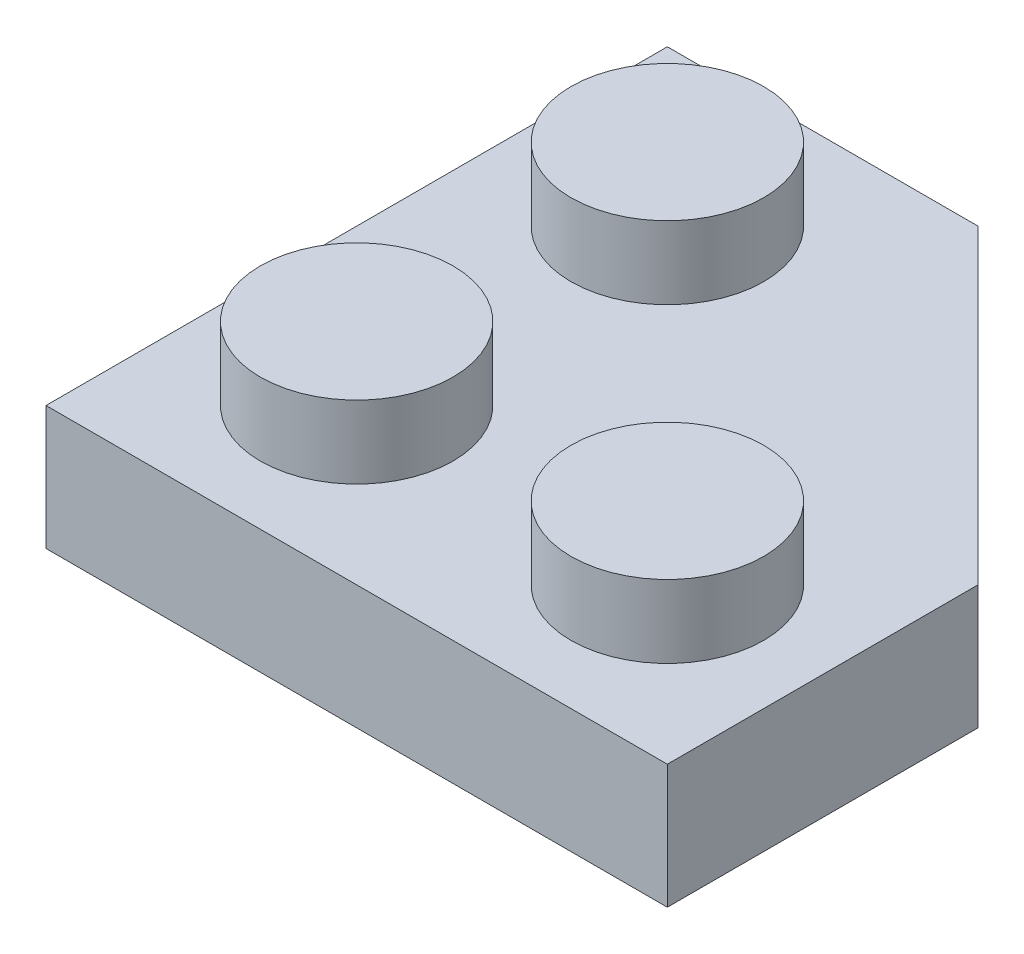
ISO-10303-21;
HEADER;
FILE_DESCRIPTION(('STEP AP214'),'2;1');
FILE_NAME('part.step','',(''),(''),'','','');
FILE_SCHEMA(('AUTOMOTIVE_DESIGN { 1 0 10303 214 1 1 1 1 }'));
ENDSEC;
DATA;
#1=APPLICATION_CONTEXT('core data for automotive mechanical design processes');
#2=APPLICATION_PROTOCOL_DEFINITION('international standard','automotive_design',2000,#1);
#3=PRODUCT_CONTEXT('',#1,'mechanical');
#4=PRODUCT('Part','Part','',(#3));
#5=PRODUCT_RELATED_PRODUCT_CATEGORY('part','',(#4));
#6=PRODUCT_DEFINITION_FORMATION('','',#4);
#7=PRODUCT_DEFINITION_CONTEXT('part definition',#1,'design');
#8=PRODUCT_DEFINITION('design','',#6,#7);
#9=PRODUCT_DEFINITION_SHAPE('','',#8);
#10=(LENGTH_UNIT() NAMED_UNIT(*) SI_UNIT(.MILLI.,.METRE.));
#11=(NAMED_UNIT(*) PLANE_ANGLE_UNIT() SI_UNIT($,.RADIAN.));
#12=(NAMED_UNIT(*) SI_UNIT($,.STERADIAN.) SOLID_ANGLE_UNIT());
#13=UNCERTAINTY_MEASURE_WITH_UNIT(LENGTH_MEASURE(1.E-05),#10,'distance_accuracy_value','');
#14=(GEOMETRIC_REPRESENTATION_CONTEXT(3) GLOBAL_UNCERTAINTY_ASSIGNED_CONTEXT((#13)) GLOBAL_UNIT_ASSIGNED_CONTEXT((#10,
#11,#12)) REPRESENTATION_CONTEXT('',''));
#15=CARTESIAN_POINT('',(0.,0.,0.));
#16=DIRECTION('',(0.,0.,1.));
#17=DIRECTION('',(1.,0.,0.));
#18=AXIS2_PLACEMENT_3D('',#15,#16,#17);
#19=CARTESIAN_POINT('',(-1.06066017177983,-3.15,-6.83933982822018));
#20=DIRECTION('',(-0.707106781186548,0.,0.707106781186548));
#21=DIRECTION('',(0.707106781186548,0.,0.707106781186548));
#22=AXIS2_PLACEMENT_3D('',#19,#20,#21);
#23=PLANE('',#22);
#24=DIRECTION('',(0.,-1.,0.));
#25=VECTOR('',#24,1.);
#26=CARTESIAN_POINT('',(4.65710678118655,-1.5,-1.12157287525381));
#27=LINE('',#26,#25);
#28=CARTESIAN_POINT('',(4.65710678118655,-1.7,-1.12157287525381));
#29=VERTEX_POINT('',#28);
#30=CARTESIAN_POINT('',(4.65710678118655,-2.95,-1.12157287525381));
#31=VERTEX_POINT('',#30);
#32=EDGE_CURVE('E334',#29,#31,#27,.T.);
#33=ORIENTED_EDGE('',*,*,#32,.T.);
#34=CARTESIAN_POINT('',(4.79852813742386,-2.95,-0.980151519016501));
#35=DIRECTION('',(-0.707106781186548,0.,0.707106781186548));
#36=DIRECTION('',(0.707106781186548,0.,0.707106781186548));
#37=AXIS2_PLACEMENT_3D('',#34,#35,#36);
#38=CIRCLE('',#37,0.2);
#39=CARTESIAN_POINT('',(4.79852813742385,-3.15,-0.9801515190165));
#40=VERTEX_POINT('',#39);
#41=EDGE_CURVE('E314',#31,#40,#38,.T.);
#42=ORIENTED_EDGE('',*,*,#41,.T.);
#43=DIRECTION('',(0.707106781186548,0.,0.707106781186548));
#44=VECTOR('',#43,1.);
#45=CARTESIAN_POINT('',(2.88933982822018,-3.15,-2.88933982822018));
#46=LINE('',#45,#44);
#47=CARTESIAN_POINT('',(6.4,-3.15,0.621320343559642));
#48=VERTEX_POINT('',#47);
#49=EDGE_CURVE('E231',#40,#48,#46,.T.);
#50=ORIENTED_EDGE('',*,*,#49,.T.);
#51=DIRECTION('',(0.,1.,0.));
#52=VECTOR('',#51,1.);
#53=CARTESIAN_POINT('',(6.4,-3.15,0.621320343559641));
#54=LINE('',#53,#52);
#55=CARTESIAN_POINT('',(6.4,-1.5,0.621320343559642));
#56=VERTEX_POINT('',#55);
#57=EDGE_CURVE('E200',#48,#56,#54,.T.);
#58=ORIENTED_EDGE('',*,*,#57,.T.);
#59=DIRECTION('',(0.707106781186548,0.,0.707106781186548));
#60=VECTOR('',#59,1.);
#61=CARTESIAN_POINT('',(2.88933982822018,-1.5,-2.88933982822018));
#62=LINE('',#61,#60);
#63=CARTESIAN_POINT('',(4.51568542494924,-1.5,-1.26299423149112));
#64=VERTEX_POINT('',#63);
#65=EDGE_CURVE('E170',#64,#56,#62,.T.);
#66=ORIENTED_EDGE('',*,*,#65,.F.);
#67=CARTESIAN_POINT('',(4.51568542494924,-1.7,-1.26299423149112));
#68=DIRECTION('',(-0.707106781186548,0.,0.707106781186548));
#69=DIRECTION('',(0.707106781186548,0.,0.707106781186548));
#70=AXIS2_PLACEMENT_3D('',#67,#68,#69);
#71=CIRCLE('',#70,0.2);
#72=EDGE_CURVE('E43',#64,#29,#71,.F.);
#73=ORIENTED_EDGE('',*,*,#72,.T.);
#74=EDGE_LOOP('',(#33,#42,#50,#58,#66,#73));
#75=FACE_BOUND('',#74,.T.);
#76=ADVANCED_FACE('F35',(#75),#23,.T.);
#77=CARTESIAN_POINT('',(7.9,-3.15,-7.9));
#78=DIRECTION('',(1.,0.,0.));
#79=DIRECTION('',(0.,0.,-1.));
#80=AXIS2_PLACEMENT_3D('',#77,#78,#79);
#81=PLANE('',#80);
#82=DIRECTION('',(0.,1.,0.));
#83=VECTOR('',#82,1.);
#84=CARTESIAN_POINT('',(7.9,-3.15,0.));
#85=LINE('',#84,#83);
#86=CARTESIAN_POINT('',(7.9,-3.15,0.));
#87=VERTEX_POINT('',#86);
#88=CARTESIAN_POINT('',(7.9,0.,0.));
#89=VERTEX_POINT('',#88);
#90=EDGE_CURVE('E236',#87,#89,#85,.T.);
#91=ORIENTED_EDGE('',*,*,#90,.T.);
#92=DIRECTION('',(0.,0.,-1.));
#93=VECTOR('',#92,1.);
#94=CARTESIAN_POINT('',(7.9,0.,-7.9));
#95=LINE('',#94,#93);
#96=CARTESIAN_POINT('',(7.9,0.,7.9));
#97=VERTEX_POINT('',#96);
#98=EDGE_CURVE('E256',#97,#89,#95,.T.);
#99=ORIENTED_EDGE('',*,*,#98,.F.);
#100=DIRECTION('',(0.,1.,0.));
#101=VECTOR('',#100,1.);
#102=CARTESIAN_POINT('',(7.9,-3.15,7.9));
#103=LINE('',#102,#101);
#104=CARTESIAN_POINT('',(7.9,-3.15,7.9));
#105=VERTEX_POINT('',#104);
#106=EDGE_CURVE('E281',#105,#97,#103,.T.);
#107=ORIENTED_EDGE('',*,*,#106,.F.);
#108=DIRECTION('',(0.,0.,-1.));
#109=VECTOR('',#108,1.);
#110=CARTESIAN_POINT('',(7.9,-3.15,-7.9));
#111=LINE('',#110,#109);
#112=EDGE_CURVE('E259',#105,#87,#111,.T.);
#113=ORIENTED_EDGE('',*,*,#112,.T.);
#114=EDGE_LOOP('',(#91,#99,#107,#113));
#115=FACE_BOUND('',#114,.T.);
#116=ADVANCED_FACE('F398',(#115),#81,.T.);
#117=CARTESIAN_POINT('',(-7.9,-3.15,7.9));
#118=DIRECTION('',(0.,0.,1.));
#119=DIRECTION('',(1.,0.,0.));
#120=AXIS2_PLACEMENT_3D('',#117,#118,#119);
#121=PLANE('',#120);
#122=DIRECTION('',(1.,0.,0.));
#123=VECTOR('',#122,1.);
#124=CARTESIAN_POINT('',(-7.9,0.,7.9));
#125=LINE('',#124,#123);
#126=CARTESIAN_POINT('',(-7.9,0.,7.9));
#127=VERTEX_POINT('',#126);
#128=EDGE_CURVE('E263',#127,#97,#125,.T.);
#129=ORIENTED_EDGE('',*,*,#128,.F.);
#130=DIRECTION('',(0.,1.,0.));
#131=VECTOR('',#130,1.);
#132=CARTESIAN_POINT('',(-7.9,-3.15,7.9));
#133=LINE('',#132,#131);
#134=CARTESIAN_POINT('',(-7.9,-3.15,7.9));
#135=VERTEX_POINT('',#134);
#136=EDGE_CURVE('E284',#135,#127,#133,.T.);
#137=ORIENTED_EDGE('',*,*,#136,.F.);
#138=DIRECTION('',(1.,0.,0.));
#139=VECTOR('',#138,1.);
#140=CARTESIAN_POINT('',(-7.9,-3.15,7.9));
#141=LINE('',#140,#139);
#142=EDGE_CURVE('E268',#135,#105,#141,.T.);
#143=ORIENTED_EDGE('',*,*,#142,.T.);
#144=ORIENTED_EDGE('',*,*,#106,.T.);
#145=EDGE_LOOP('',(#129,#137,#143,#144));
#146=FACE_BOUND('',#145,.T.);
#147=ADVANCED_FACE('F394',(#146),#121,.T.);
#148=CARTESIAN_POINT('',(-7.90000000000001,-3.15,-7.9));
#149=DIRECTION('',(-1.,0.,0.));
#150=DIRECTION('',(0.,0.,1.));
#151=AXIS2_PLACEMENT_3D('',#148,#149,#150);
#152=PLANE('',#151);
#153=DIRECTION('',(0.,0.,1.));
#154=VECTOR('',#153,1.);
#155=CARTESIAN_POINT('',(-7.90000000000001,0.,-7.9));
#156=LINE('',#155,#154);
#157=CARTESIAN_POINT('',(-7.90000000000001,0.,-7.9));
#158=VERTEX_POINT('',#157);
#159=EDGE_CURVE('E276',#158,#127,#156,.T.);
#160=ORIENTED_EDGE('',*,*,#159,.F.);
#161=DIRECTION('',(0.,1.,0.));
#162=VECTOR('',#161,1.);
#163=CARTESIAN_POINT('',(-7.90000000000001,-3.15,-7.9));
#164=LINE('',#163,#162);
#165=CARTESIAN_POINT('',(-7.90000000000001,-3.15,-7.9));
#166=VERTEX_POINT('',#165);
#167=EDGE_CURVE('E271',#166,#158,#164,.T.);
#168=ORIENTED_EDGE('',*,*,#167,.F.);
#169=DIRECTION('',(0.,0.,1.));
#170=VECTOR('',#169,1.);
#171=CARTESIAN_POINT('',(-7.90000000000001,-3.15,-7.9));
#172=LINE('',#171,#170);
#173=EDGE_CURVE('E265',#166,#135,#172,.T.);
#174=ORIENTED_EDGE('',*,*,#173,.T.);
#175=ORIENTED_EDGE('',*,*,#136,.T.);
#176=EDGE_LOOP('',(#160,#168,#174,#175));
#177=FACE_BOUND('',#176,.T.);
#178=ADVANCED_FACE('F387',(#177),#152,.T.);
#179=CARTESIAN_POINT('',(-7.90000000000001,-3.15,-7.9));
#180=DIRECTION('',(0.,0.,-1.));
#181=DIRECTION('',(-1.,0.,0.));
#182=AXIS2_PLACEMENT_3D('',#179,#180,#181);
#183=PLANE('',#182);
#184=DIRECTION('',(0.,1.,0.));
#185=VECTOR('',#184,1.);
#186=CARTESIAN_POINT('',(0.,-3.15,-7.9));
#187=LINE('',#186,#185);
#188=CARTESIAN_POINT('',(0.,-3.15,-7.9));
#189=VERTEX_POINT('',#188);
#190=CARTESIAN_POINT('',(0.,0.,-7.9));
#191=VERTEX_POINT('',#190);
#192=EDGE_CURVE('E235',#189,#191,#187,.T.);
#193=ORIENTED_EDGE('',*,*,#192,.F.);
#194=DIRECTION('',(-1.,0.,0.));
#195=VECTOR('',#194,1.);
#196=CARTESIAN_POINT('',(-7.90000000000001,-3.15,-7.9));
#197=LINE('',#196,#195);
#198=EDGE_CURVE('E262',#189,#166,#197,.T.);
#199=ORIENTED_EDGE('',*,*,#198,.T.);
#200=ORIENTED_EDGE('',*,*,#167,.T.);
#201=DIRECTION('',(-1.,0.,0.));
#202=VECTOR('',#201,1.);
#203=CARTESIAN_POINT('',(-7.90000000000001,0.,-7.9));
#204=LINE('',#203,#202);
#205=EDGE_CURVE('E274',#191,#158,#204,.T.);
#206=ORIENTED_EDGE('',*,*,#205,.F.);
#207=EDGE_LOOP('',(#193,#199,#200,#206));
#208=FACE_BOUND('',#207,.T.);
#209=ADVANCED_FACE('F383',(#208),#183,.T.);
#210=CARTESIAN_POINT('',(0.,-3.15,0.));
#211=DIRECTION('',(0.,1.,0.));
#212=DIRECTION('',(0.,0.,1.));
#213=AXIS2_PLACEMENT_3D('',#210,#211,#212);
#214=PLANE('',#213);
#215=DIRECTION('',(0.707106781186548,0.,0.707106781186547));
#216=VECTOR('',#215,1.);
#217=CARTESIAN_POINT('',(0.,-3.15,-7.9));
#218=LINE('',#217,#216);
#219=CARTESIAN_POINT('',(2.04081169079632,-3.15,-5.85918830920368));
#220=VERTEX_POINT('',#219);
#221=EDGE_CURVE('E232',#189,#220,#218,.T.);
#222=ORIENTED_EDGE('',*,*,#221,.T.);
#223=DIRECTION('',(0.707106781186548,0.,-0.707106781186547));
#224=VECTOR('',#223,1.);
#225=CARTESIAN_POINT('',(-1.90918830920368,-3.15,-1.90918830920368));
#226=LINE('',#225,#224);
#227=CARTESIAN_POINT('',(0.980151519016497,-3.15,-4.79852813742386));
#228=VERTEX_POINT('',#227);
#229=EDGE_CURVE('E301',#220,#228,#226,.F.);
#230=ORIENTED_EDGE('',*,*,#229,.T.);
#231=CARTESIAN_POINT('',(-0.621320343559648,-3.15,-6.4));
#232=VERTEX_POINT('',#231);
#233=EDGE_CURVE('E201',#232,#228,#46,.T.);
#234=ORIENTED_EDGE('',*,*,#233,.F.);
#235=DIRECTION('',(-1.,0.,0.));
#236=VECTOR('',#235,1.);
#237=CARTESIAN_POINT('',(0.,-3.15,-6.4));
#238=LINE('',#237,#236);
#239=CARTESIAN_POINT('',(-6.40000000000001,-3.15,-6.4));
#240=VERTEX_POINT('',#239);
#241=EDGE_CURVE('E189',#232,#240,#238,.T.);
#242=ORIENTED_EDGE('',*,*,#241,.T.);
#243=DIRECTION('',(0.,0.,1.));
#244=VECTOR('',#243,1.);
#245=CARTESIAN_POINT('',(-6.40000000000001,-3.15,0.));
#246=LINE('',#245,#244);
#247=CARTESIAN_POINT('',(-6.4,-3.15,6.4));
#248=VERTEX_POINT('',#247);
#249=EDGE_CURVE('E224',#240,#248,#246,.T.);
#250=ORIENTED_EDGE('',*,*,#249,.T.);
#251=DIRECTION('',(1.,0.,0.));
#252=VECTOR('',#251,1.);
#253=CARTESIAN_POINT('',(0.,-3.15,6.4));
#254=LINE('',#253,#252);
#255=CARTESIAN_POINT('',(6.4,-3.15,6.4));
#256=VERTEX_POINT('',#255);
#257=EDGE_CURVE('E197',#248,#256,#254,.T.);
#258=ORIENTED_EDGE('',*,*,#257,.T.);
#259=DIRECTION('',(0.,0.,-1.));
#260=VECTOR('',#259,1.);
#261=CARTESIAN_POINT('',(6.4,-3.15,0.));
#262=LINE('',#261,#260);
#263=EDGE_CURVE('E166',#256,#48,#262,.T.);
#264=ORIENTED_EDGE('',*,*,#263,.T.);
#265=ORIENTED_EDGE('',*,*,#49,.F.);
#266=DIRECTION('',(0.707106781186548,0.,-0.707106781186547));
#267=VECTOR('',#266,1.);
#268=CARTESIAN_POINT('',(1.90918830920368,-3.15,1.90918830920368));
#269=LINE('',#268,#267);
#270=CARTESIAN_POINT('',(5.85918830920368,-3.15,-2.04081169079632));
#271=VERTEX_POINT('',#270);
#272=EDGE_CURVE('E298',#40,#271,#269,.T.);
#273=ORIENTED_EDGE('',*,*,#272,.T.);
#274=EDGE_CURVE('E205',#271,#87,#218,.T.);
#275=ORIENTED_EDGE('',*,*,#274,.T.);
#276=ORIENTED_EDGE('',*,*,#112,.F.);
#277=ORIENTED_EDGE('',*,*,#142,.F.);
#278=ORIENTED_EDGE('',*,*,#173,.F.);
#279=ORIENTED_EDGE('',*,*,#198,.F.);
#280=EDGE_LOOP('',(#222,#230,#234,#242,#250,#258,#264,#265,#273,#275,#276,#277,#278,#279));
#281=FACE_BOUND('',#280,.T.);
#282=ADVANCED_FACE('F352',(#281),#214,.F.);
#283=CARTESIAN_POINT('',(0.,0.,0.));
#284=DIRECTION('',(0.,1.,0.));
#285=DIRECTION('',(0.,0.,1.));
#286=AXIS2_PLACEMENT_3D('',#283,#284,#285);
#287=PLANE('',#286);
#288=DIRECTION('',(0.707106781186548,0.,0.707106781186548));
#289=VECTOR('',#288,1.);
#290=CARTESIAN_POINT('',(3.95,0.,-3.95));
#291=LINE('',#290,#289);
#292=EDGE_CURVE('E283',#191,#89,#291,.T.);
#293=ORIENTED_EDGE('',*,*,#292,.F.);
#294=ORIENTED_EDGE('',*,*,#205,.T.);
#295=ORIENTED_EDGE('',*,*,#159,.T.);
#296=ORIENTED_EDGE('',*,*,#128,.T.);
#297=ORIENTED_EDGE('',*,*,#98,.T.);
#298=EDGE_LOOP('',(#293,#294,#295,#296,#297));
#299=FACE_BOUND('',#298,.T.);
#300=CARTESIAN_POINT('',(3.95,0.,3.95));
#301=DIRECTION('',(0.,1.,0.));
#302=DIRECTION('',(0.,0.,1.));
#303=AXIS2_PLACEMENT_3D('',#300,#301,#302);
#304=CIRCLE('',#303,2.45);
#305=CARTESIAN_POINT('',(3.95,0.,6.4));
#306=VERTEX_POINT('',#305);
#307=EDGE_CURVE('E239',#306,#306,#304,.T.);
#308=ORIENTED_EDGE('',*,*,#307,.F.);
#309=EDGE_LOOP('',(#308));
#310=FACE_BOUND('',#309,.T.);
#311=CARTESIAN_POINT('',(-3.95000000000001,0.,3.95));
#312=DIRECTION('',(0.,1.,0.));
#313=DIRECTION('',(0.,0.,1.));
#314=AXIS2_PLACEMENT_3D('',#311,#312,#313);
#315=CIRCLE('',#314,2.45);
#316=CARTESIAN_POINT('',(-3.95000000000001,0.,6.4));
#317=VERTEX_POINT('',#316);
#318=EDGE_CURVE('E244',#317,#317,#315,.T.);
#319=ORIENTED_EDGE('',*,*,#318,.F.);
#320=EDGE_LOOP('',(#319));
#321=FACE_BOUND('',#320,.T.);
#322=CARTESIAN_POINT('',(-3.95000000000001,0.,-3.95));
#323=DIRECTION('',(0.,1.,0.));
#324=DIRECTION('',(0.,0.,1.));
#325=AXIS2_PLACEMENT_3D('',#322,#323,#324);
#326=CIRCLE('',#325,2.45);
#327=CARTESIAN_POINT('',(-3.95000000000001,0.,-1.5));
#328=VERTEX_POINT('',#327);
#329=EDGE_CURVE('E250',#328,#328,#326,.T.);
#330=ORIENTED_EDGE('',*,*,#329,.F.);
#331=EDGE_LOOP('',(#330));
#332=FACE_BOUND('',#331,.T.);
#333=ADVANCED_FACE('F391',(#299,#310,#321,#332),#287,.T.);
#334=CARTESIAN_POINT('',(-3.95000000000001,1.85,-3.95));
#335=DIRECTION('',(0.,-1.,0.));
#336=DIRECTION('',(0.,0.,-1.));
#337=AXIS2_PLACEMENT_3D('',#334,#335,#336);
#338=CYLINDRICAL_SURFACE('',#337,2.45);
#339=CARTESIAN_POINT('',(-3.95000000000001,1.85,-3.95));
#340=DIRECTION('',(0.,1.,0.));
#341=DIRECTION('',(0.,0.,1.));
#342=AXIS2_PLACEMENT_3D('',#339,#340,#341);
#343=CIRCLE('',#342,2.45);
#344=CARTESIAN_POINT('',(-3.95000000000001,1.85,-1.5));
#345=VERTEX_POINT('',#344);
#346=EDGE_CURVE('E253',#345,#345,#343,.T.);
#347=ORIENTED_EDGE('',*,*,#346,.F.);
#348=EDGE_LOOP('',(#347));
#349=FACE_BOUND('',#348,.T.);
#350=ORIENTED_EDGE('',*,*,#329,.T.);
#351=EDGE_LOOP('',(#350));
#352=FACE_BOUND('',#351,.T.);
#353=ADVANCED_FACE('F643',(#349,#352),#338,.T.);
#354=CARTESIAN_POINT('',(-3.95000000000001,1.85,-3.95));
#355=DIRECTION('',(0.,1.,0.));
#356=DIRECTION('',(0.,0.,1.));
#357=AXIS2_PLACEMENT_3D('',#354,#355,#356);
#358=PLANE('',#357);
#359=ORIENTED_EDGE('',*,*,#346,.T.);
#360=EDGE_LOOP('',(#359));
#361=FACE_BOUND('',#360,.T.);
#362=ADVANCED_FACE('F698',(#361),#358,.T.);
#363=CARTESIAN_POINT('',(-3.95000000000001,1.85,3.95));
#364=DIRECTION('',(0.,-1.,0.));
#365=DIRECTION('',(0.,0.,-1.));
#366=AXIS2_PLACEMENT_3D('',#363,#364,#365);
#367=CYLINDRICAL_SURFACE('',#366,2.45);
#368=CARTESIAN_POINT('',(-3.95000000000001,1.85,3.95));
#369=DIRECTION('',(0.,1.,0.));
#370=DIRECTION('',(0.,0.,1.));
#371=AXIS2_PLACEMENT_3D('',#368,#369,#370);
#372=CIRCLE('',#371,2.45);
#373=CARTESIAN_POINT('',(-3.95000000000001,1.85,6.4));
#374=VERTEX_POINT('',#373);
#375=EDGE_CURVE('E247',#374,#374,#372,.T.);
#376=ORIENTED_EDGE('',*,*,#375,.F.);
#377=EDGE_LOOP('',(#376));
#378=FACE_BOUND('',#377,.T.);
#379=ORIENTED_EDGE('',*,*,#318,.T.);
#380=EDGE_LOOP('',(#379));
#381=FACE_BOUND('',#380,.T.);
#382=ADVANCED_FACE('F688',(#378,#381),#367,.T.);
#383=CARTESIAN_POINT('',(-3.95000000000001,1.85,3.95));
#384=DIRECTION('',(0.,1.,0.));
#385=DIRECTION('',(0.,0.,1.));
#386=AXIS2_PLACEMENT_3D('',#383,#384,#385);
#387=PLANE('',#386);
#388=ORIENTED_EDGE('',*,*,#375,.T.);
#389=EDGE_LOOP('',(#388));
#390=FACE_BOUND('',#389,.T.);
#391=ADVANCED_FACE('F678',(#390),#387,.T.);
#392=CARTESIAN_POINT('',(3.95,1.85,3.95));
#393=DIRECTION('',(0.,-1.,0.));
#394=DIRECTION('',(0.,0.,-1.));
#395=AXIS2_PLACEMENT_3D('',#392,#393,#394);
#396=CYLINDRICAL_SURFACE('',#395,2.45);
#397=CARTESIAN_POINT('',(3.95,1.85,3.95));
#398=DIRECTION('',(0.,1.,0.));
#399=DIRECTION('',(0.,0.,1.));
#400=AXIS2_PLACEMENT_3D('',#397,#398,#399);
#401=CIRCLE('',#400,2.45);
#402=CARTESIAN_POINT('',(3.95,1.85,6.4));
#403=VERTEX_POINT('',#402);
#404=EDGE_CURVE('E241',#403,#403,#401,.T.);
#405=ORIENTED_EDGE('',*,*,#404,.F.);
#406=EDGE_LOOP('',(#405));
#407=FACE_BOUND('',#406,.T.);
#408=ORIENTED_EDGE('',*,*,#307,.T.);
#409=EDGE_LOOP('',(#408));
#410=FACE_BOUND('',#409,.T.);
#411=ADVANCED_FACE('F668',(#407,#410),#396,.T.);
#412=CARTESIAN_POINT('',(3.95,1.85,3.95));
#413=DIRECTION('',(0.,1.,0.));
#414=DIRECTION('',(0.,0.,1.));
#415=AXIS2_PLACEMENT_3D('',#412,#413,#414);
#416=PLANE('',#415);
#417=ORIENTED_EDGE('',*,*,#404,.T.);
#418=EDGE_LOOP('',(#417));
#419=FACE_BOUND('',#418,.T.);
#420=ADVANCED_FACE('F563',(#419),#416,.T.);
#421=CARTESIAN_POINT('',(0.,-3.15,-7.9));
#422=DIRECTION('',(-0.707106781186548,0.,0.707106781186548));
#423=DIRECTION('',(0.707106781186548,0.,0.707106781186548));
#424=AXIS2_PLACEMENT_3D('',#421,#422,#423);
#425=PLANE('',#424);
#426=DIRECTION('',(0.,1.,0.));
#427=VECTOR('',#426,1.);
#428=CARTESIAN_POINT('',(2.18223304703363,-1.5,-5.71776695296637));
#429=LINE('',#428,#427);
#430=CARTESIAN_POINT('',(2.18223304703363,-2.95,-5.71776695296637));
#431=VERTEX_POINT('',#430);
#432=CARTESIAN_POINT('',(2.18223304703363,-1.7,-5.71776695296637));
#433=VERTEX_POINT('',#432);
#434=EDGE_CURVE('E335',#431,#433,#429,.T.);
#435=ORIENTED_EDGE('',*,*,#434,.F.);
#436=CARTESIAN_POINT('',(2.04081169079632,-2.95,-5.85918830920368));
#437=DIRECTION('',(-0.707106781186548,0.,0.707106781186548));
#438=DIRECTION('',(0.707106781186548,0.,0.707106781186548));
#439=AXIS2_PLACEMENT_3D('',#436,#437,#438);
#440=CIRCLE('',#439,0.2);
#441=EDGE_CURVE('E296',#431,#220,#440,.F.);
#442=ORIENTED_EDGE('',*,*,#441,.T.);
#443=ORIENTED_EDGE('',*,*,#221,.F.);
#444=ORIENTED_EDGE('',*,*,#192,.T.);
#445=ORIENTED_EDGE('',*,*,#292,.T.);
#446=ORIENTED_EDGE('',*,*,#90,.F.);
#447=ORIENTED_EDGE('',*,*,#274,.F.);
#448=CARTESIAN_POINT('',(5.85918830920368,-2.95,-2.04081169079632));
#449=DIRECTION('',(-0.707106781186548,0.,0.707106781186548));
#450=DIRECTION('',(0.707106781186548,0.,0.707106781186548));
#451=AXIS2_PLACEMENT_3D('',#448,#449,#450);
#452=CIRCLE('',#451,0.2);
#453=CARTESIAN_POINT('',(5.71776695296637,-2.95,-2.18223304703363));
#454=VERTEX_POINT('',#453);
#455=EDGE_CURVE('E294',#271,#454,#452,.F.);
#456=ORIENTED_EDGE('',*,*,#455,.T.);
#457=DIRECTION('',(0.,-1.,0.));
#458=VECTOR('',#457,1.);
#459=CARTESIAN_POINT('',(5.71776695296637,-1.5,-2.18223304703363));
#460=LINE('',#459,#458);
#461=CARTESIAN_POINT('',(5.71776695296637,-1.7,-2.18223304703363));
#462=VERTEX_POINT('',#461);
#463=EDGE_CURVE('E329',#462,#454,#460,.T.);
#464=ORIENTED_EDGE('',*,*,#463,.F.);
#465=CARTESIAN_POINT('',(5.57634559672906,-1.7,-2.32365440327094));
#466=DIRECTION('',(-0.707106781186548,0.,0.707106781186548));
#467=DIRECTION('',(0.707106781186548,0.,0.707106781186548));
#468=AXIS2_PLACEMENT_3D('',#465,#466,#467);
#469=CIRCLE('',#468,0.2);
#470=CARTESIAN_POINT('',(5.57634559672906,-1.5,-2.32365440327094));
#471=VERTEX_POINT('',#470);
#472=EDGE_CURVE('E321',#462,#471,#469,.T.);
#473=ORIENTED_EDGE('',*,*,#472,.T.);
#474=DIRECTION('',(0.707106781186547,0.,0.707106781186548));
#475=VECTOR('',#474,1.);
#476=CARTESIAN_POINT('',(5.71776695296637,-1.5,-2.18223304703363));
#477=LINE('',#476,#475);
#478=CARTESIAN_POINT('',(2.32365440327094,-1.5,-5.57634559672906));
#479=VERTEX_POINT('',#478);
#480=EDGE_CURVE('E328',#479,#471,#477,.T.);
#481=ORIENTED_EDGE('',*,*,#480,.F.);
#482=CARTESIAN_POINT('',(2.32365440327094,-1.7,-5.57634559672906));
#483=DIRECTION('',(-0.707106781186548,0.,0.707106781186548));
#484=DIRECTION('',(0.707106781186548,0.,0.707106781186548));
#485=AXIS2_PLACEMENT_3D('',#482,#483,#484);
#486=CIRCLE('',#485,0.2);
#487=EDGE_CURVE('E316',#479,#433,#486,.T.);
#488=ORIENTED_EDGE('',*,*,#487,.T.);
#489=EDGE_LOOP('',(#435,#442,#443,#444,#445,#446,#447,#456,#464,#473,#481,#488));
#490=FACE_BOUND('',#489,.T.);
#491=ADVANCED_FACE('F327',(#490),#425,.F.);
#492=CARTESIAN_POINT('',(6.4,-3.15,-7.9));
#493=DIRECTION('',(1.,0.,0.));
#494=DIRECTION('',(0.,0.,-1.));
#495=AXIS2_PLACEMENT_3D('',#492,#493,#494);
#496=PLANE('',#495);
#497=ORIENTED_EDGE('',*,*,#57,.F.);
#498=ORIENTED_EDGE('',*,*,#263,.F.);
#499=DIRECTION('',(0.,1.,0.));
#500=VECTOR('',#499,1.);
#501=CARTESIAN_POINT('',(6.4,-3.15,6.4));
#502=LINE('',#501,#500);
#503=CARTESIAN_POINT('',(6.4,-1.5,6.4));
#504=VERTEX_POINT('',#503);
#505=EDGE_CURVE('E160',#256,#504,#502,.T.);
#506=ORIENTED_EDGE('',*,*,#505,.T.);
#507=DIRECTION('',(0.,0.,-1.));
#508=VECTOR('',#507,1.);
#509=CARTESIAN_POINT('',(6.4,-1.5,0.));
#510=LINE('',#509,#508);
#511=EDGE_CURVE('E164',#504,#56,#510,.T.);
#512=ORIENTED_EDGE('',*,*,#511,.T.);
#513=EDGE_LOOP('',(#497,#498,#506,#512));
#514=FACE_BOUND('',#513,.T.);
#515=ADVANCED_FACE('F163',(#514),#496,.F.);
#516=CARTESIAN_POINT('',(-7.9,-3.15,6.4));
#517=DIRECTION('',(0.,0.,1.));
#518=DIRECTION('',(1.,0.,0.));
#519=AXIS2_PLACEMENT_3D('',#516,#517,#518);
#520=PLANE('',#519);
#521=DIRECTION('',(1.,0.,0.));
#522=VECTOR('',#521,1.);
#523=CARTESIAN_POINT('',(0.,-1.5,6.4));
#524=LINE('',#523,#522);
#525=CARTESIAN_POINT('',(-6.4,-1.5,6.4));
#526=VERTEX_POINT('',#525);
#527=EDGE_CURVE('E178',#526,#504,#524,.T.);
#528=ORIENTED_EDGE('',*,*,#527,.T.);
#529=ORIENTED_EDGE('',*,*,#505,.F.);
#530=ORIENTED_EDGE('',*,*,#257,.F.);
#531=DIRECTION('',(0.,1.,0.));
#532=VECTOR('',#531,1.);
#533=CARTESIAN_POINT('',(-6.4,-3.15,6.4));
#534=LINE('',#533,#532);
#535=EDGE_CURVE('E171',#248,#526,#534,.T.);
#536=ORIENTED_EDGE('',*,*,#535,.T.);
#537=EDGE_LOOP('',(#528,#529,#530,#536));
#538=FACE_BOUND('',#537,.T.);
#539=ADVANCED_FACE('F184',(#538),#520,.F.);
#540=CARTESIAN_POINT('',(-6.40000000000001,-3.15,-7.9));
#541=DIRECTION('',(-1.,0.,0.));
#542=DIRECTION('',(0.,0.,1.));
#543=AXIS2_PLACEMENT_3D('',#540,#541,#542);
#544=PLANE('',#543);
#545=DIRECTION('',(0.,0.,1.));
#546=VECTOR('',#545,1.);
#547=CARTESIAN_POINT('',(-6.40000000000001,-1.5,0.));
#548=LINE('',#547,#546);
#549=CARTESIAN_POINT('',(-6.40000000000001,-1.5,-6.4));
#550=VERTEX_POINT('',#549);
#551=EDGE_CURVE('E187',#550,#526,#548,.T.);
#552=ORIENTED_EDGE('',*,*,#551,.T.);
#553=ORIENTED_EDGE('',*,*,#535,.F.);
#554=ORIENTED_EDGE('',*,*,#249,.F.);
#555=DIRECTION('',(0.,1.,0.));
#556=VECTOR('',#555,1.);
#557=CARTESIAN_POINT('',(-6.40000000000001,-3.15,-6.4));
#558=LINE('',#557,#556);
#559=EDGE_CURVE('E193',#240,#550,#558,.T.);
#560=ORIENTED_EDGE('',*,*,#559,.T.);
#561=EDGE_LOOP('',(#552,#553,#554,#560));
#562=FACE_BOUND('',#561,.T.);
#563=ADVANCED_FACE('F356',(#562),#544,.F.);
#564=CARTESIAN_POINT('',(-7.90000000000001,-3.15,-6.4));
#565=DIRECTION('',(0.,0.,-1.));
#566=DIRECTION('',(-1.,0.,0.));
#567=AXIS2_PLACEMENT_3D('',#564,#565,#566);
#568=PLANE('',#567);
#569=DIRECTION('',(0.,1.,0.));
#570=VECTOR('',#569,1.);
#571=CARTESIAN_POINT('',(-0.621320343559648,-3.15,-6.4));
#572=LINE('',#571,#570);
#573=CARTESIAN_POINT('',(-0.621320343559648,-1.5,-6.4));
#574=VERTEX_POINT('',#573);
#575=EDGE_CURVE('E198',#232,#574,#572,.T.);
#576=ORIENTED_EDGE('',*,*,#575,.T.);
#577=DIRECTION('',(-1.,0.,0.));
#578=VECTOR('',#577,1.);
#579=CARTESIAN_POINT('',(0.,-1.5,-6.4));
#580=LINE('',#579,#578);
#581=EDGE_CURVE('E181',#574,#550,#580,.T.);
#582=ORIENTED_EDGE('',*,*,#581,.T.);
#583=ORIENTED_EDGE('',*,*,#559,.F.);
#584=ORIENTED_EDGE('',*,*,#241,.F.);
#585=EDGE_LOOP('',(#576,#582,#583,#584));
#586=FACE_BOUND('',#585,.T.);
#587=ADVANCED_FACE('F360',(#586),#568,.F.);
#588=CARTESIAN_POINT('',(0.,-1.5,0.));
#589=DIRECTION('',(0.,1.,0.));
#590=DIRECTION('',(0.,0.,1.));
#591=AXIS2_PLACEMENT_3D('',#588,#589,#590);
#592=PLANE('',#591);
#593=CARTESIAN_POINT('',(0.,-1.5,0.));
#594=DIRECTION('',(0.,1.,0.));
#595=DIRECTION('',(0.,0.,1.));
#596=AXIS2_PLACEMENT_3D('',#593,#594,#595);
#597=CIRCLE('',#596,3.25);
#598=CARTESIAN_POINT('',(0.,-1.5,3.25));
#599=VERTEX_POINT('',#598);
#600=EDGE_CURVE('E12',#599,#599,#597,.F.);
#601=ORIENTED_EDGE('',*,*,#600,.F.);
#602=EDGE_LOOP('',(#601));
#603=FACE_BOUND('',#602,.T.);
#604=CARTESIAN_POINT('',(1.26299423149112,-1.5,-4.51568542494924));
#605=VERTEX_POINT('',#604);
#606=EDGE_CURVE('E203',#574,#605,#62,.T.);
#607=ORIENTED_EDGE('',*,*,#606,.T.);
#608=DIRECTION('',(0.707106781186548,0.,-0.707106781186547));
#609=VECTOR('',#608,1.);
#610=CARTESIAN_POINT('',(2.32365440327094,-1.5,-5.57634559672906));
#611=LINE('',#610,#609);
#612=EDGE_CURVE('E307',#605,#479,#611,.T.);
#613=ORIENTED_EDGE('',*,*,#612,.T.);
#614=ORIENTED_EDGE('',*,*,#480,.T.);
#615=DIRECTION('',(0.707106781186548,0.,-0.707106781186547));
#616=VECTOR('',#615,1.);
#617=CARTESIAN_POINT('',(4.51568542494924,-1.5,-1.26299423149112));
#618=LINE('',#617,#616);
#619=EDGE_CURVE('E305',#471,#64,#618,.F.);
#620=ORIENTED_EDGE('',*,*,#619,.T.);
#621=ORIENTED_EDGE('',*,*,#65,.T.);
#622=ORIENTED_EDGE('',*,*,#511,.F.);
#623=ORIENTED_EDGE('',*,*,#527,.F.);
#624=ORIENTED_EDGE('',*,*,#551,.F.);
#625=ORIENTED_EDGE('',*,*,#581,.F.);
#626=EDGE_LOOP('',(#607,#613,#614,#620,#621,#622,#623,#624,#625));
#627=FACE_BOUND('',#626,.T.);
#628=CARTESIAN_POINT('',(3.95,-1.5,3.95));
#629=DIRECTION('',(0.,1.,0.));
#630=DIRECTION('',(0.,0.,1.));
#631=AXIS2_PLACEMENT_3D('',#628,#629,#630);
#632=CIRCLE('',#631,0.950000000000001);
#633=CARTESIAN_POINT('',(3.95,-1.5,4.9));
#634=VERTEX_POINT('',#633);
#635=EDGE_CURVE('E206',#634,#634,#632,.T.);
#636=ORIENTED_EDGE('',*,*,#635,.T.);
#637=EDGE_LOOP('',(#636));
#638=FACE_BOUND('',#637,.T.);
#639=CARTESIAN_POINT('',(-3.95000000000001,-1.5,3.95));
#640=DIRECTION('',(0.,1.,0.));
#641=DIRECTION('',(0.,0.,1.));
#642=AXIS2_PLACEMENT_3D('',#639,#640,#641);
#643=CIRCLE('',#642,0.950000000000001);
#644=CARTESIAN_POINT('',(-3.95000000000001,-1.5,4.9));
#645=VERTEX_POINT('',#644);
#646=EDGE_CURVE('E210',#645,#645,#643,.T.);
#647=ORIENTED_EDGE('',*,*,#646,.T.);
#648=EDGE_LOOP('',(#647));
#649=FACE_BOUND('',#648,.T.);
#650=CARTESIAN_POINT('',(-3.95000000000001,-1.5,-3.95));
#651=DIRECTION('',(0.,1.,0.));
#652=DIRECTION('',(0.,0.,1.));
#653=AXIS2_PLACEMENT_3D('',#650,#651,#652);
#654=CIRCLE('',#653,0.950000000000001);
#655=CARTESIAN_POINT('',(-3.95000000000001,-1.5,-3.));
#656=VERTEX_POINT('',#655);
#657=EDGE_CURVE('E214',#656,#656,#654,.T.);
#658=ORIENTED_EDGE('',*,*,#657,.T.);
#659=EDGE_LOOP('',(#658));
#660=FACE_BOUND('',#659,.T.);
#661=ADVANCED_FACE('F175',(#603,#627,#638,#649,#660),#592,.F.);
#662=CARTESIAN_POINT('',(-3.95000000000001,1.85,-3.95));
#663=DIRECTION('',(0.,-1.,0.));
#664=DIRECTION('',(0.,0.,-1.));
#665=AXIS2_PLACEMENT_3D('',#662,#663,#664);
#666=CYLINDRICAL_SURFACE('',#665,0.950000000000001);
#667=CARTESIAN_POINT('',(-3.95000000000001,0.35,-3.95));
#668=DIRECTION('',(0.,1.,0.));
#669=DIRECTION('',(0.,0.,1.));
#670=AXIS2_PLACEMENT_3D('',#667,#668,#669);
#671=CIRCLE('',#670,0.950000000000001);
#672=CARTESIAN_POINT('',(-3.95000000000001,0.35,-3.));
#673=VERTEX_POINT('',#672);
#674=EDGE_CURVE('E182',#673,#673,#671,.T.);
#675=ORIENTED_EDGE('',*,*,#674,.T.);
#676=EDGE_LOOP('',(#675));
#677=FACE_BOUND('',#676,.T.);
#678=ORIENTED_EDGE('',*,*,#657,.F.);
#679=EDGE_LOOP('',(#678));
#680=FACE_BOUND('',#679,.T.);
#681=ADVANCED_FACE('F445',(#677,#680),#666,.F.);
#682=CARTESIAN_POINT('',(-3.95000000000001,0.35,-3.95));
#683=DIRECTION('',(0.,1.,0.));
#684=DIRECTION('',(0.,0.,1.));
#685=AXIS2_PLACEMENT_3D('',#682,#683,#684);
#686=PLANE('',#685);
#687=ORIENTED_EDGE('',*,*,#674,.F.);
#688=EDGE_LOOP('',(#687));
#689=FACE_BOUND('',#688,.T.);
#690=ADVANCED_FACE('F441',(#689),#686,.F.);
#691=CARTESIAN_POINT('',(-3.95000000000001,1.85,3.95));
#692=DIRECTION('',(0.,-1.,0.));
#693=DIRECTION('',(0.,0.,-1.));
#694=AXIS2_PLACEMENT_3D('',#691,#692,#693);
#695=CYLINDRICAL_SURFACE('',#694,0.950000000000001);
#696=CARTESIAN_POINT('',(-3.95000000000001,0.35,3.95));
#697=DIRECTION('',(0.,1.,0.));
#698=DIRECTION('',(0.,0.,1.));
#699=AXIS2_PLACEMENT_3D('',#696,#697,#698);
#700=CIRCLE('',#699,0.950000000000001);
#701=CARTESIAN_POINT('',(-3.95000000000001,0.35,4.9));
#702=VERTEX_POINT('',#701);
#703=EDGE_CURVE('E213',#702,#702,#700,.T.);
#704=ORIENTED_EDGE('',*,*,#703,.T.);
#705=EDGE_LOOP('',(#704));
#706=FACE_BOUND('',#705,.T.);
#707=ORIENTED_EDGE('',*,*,#646,.F.);
#708=EDGE_LOOP('',(#707));
#709=FACE_BOUND('',#708,.T.);
#710=ADVANCED_FACE('F437',(#706,#709),#695,.F.);
#711=CARTESIAN_POINT('',(-3.95000000000001,0.35,3.95));
#712=DIRECTION('',(0.,1.,0.));
#713=DIRECTION('',(0.,0.,1.));
#714=AXIS2_PLACEMENT_3D('',#711,#712,#713);
#715=PLANE('',#714);
#716=ORIENTED_EDGE('',*,*,#703,.F.);
#717=EDGE_LOOP('',(#716));
#718=FACE_BOUND('',#717,.T.);
#719=ADVANCED_FACE('F430',(#718),#715,.F.);
#720=CARTESIAN_POINT('',(3.95,1.85,3.95));
#721=DIRECTION('',(0.,-1.,0.));
#722=DIRECTION('',(0.,0.,-1.));
#723=AXIS2_PLACEMENT_3D('',#720,#721,#722);
#724=CYLINDRICAL_SURFACE('',#723,0.950000000000001);
#725=CARTESIAN_POINT('',(3.95,0.35,3.95));
#726=DIRECTION('',(0.,1.,0.));
#727=DIRECTION('',(0.,0.,1.));
#728=AXIS2_PLACEMENT_3D('',#725,#726,#727);
#729=CIRCLE('',#728,0.950000000000001);
#730=CARTESIAN_POINT('',(3.95,0.35,4.9));
#731=VERTEX_POINT('',#730);
#732=EDGE_CURVE('E209',#731,#731,#729,.T.);
#733=ORIENTED_EDGE('',*,*,#732,.T.);
#734=EDGE_LOOP('',(#733));
#735=FACE_BOUND('',#734,.T.);
#736=ORIENTED_EDGE('',*,*,#635,.F.);
#737=EDGE_LOOP('',(#736));
#738=FACE_BOUND('',#737,.T.);
#739=ADVANCED_FACE('F425',(#735,#738),#724,.F.);
#740=CARTESIAN_POINT('',(3.95,0.35,3.95));
#741=DIRECTION('',(0.,1.,0.));
#742=DIRECTION('',(0.,0.,1.));
#743=AXIS2_PLACEMENT_3D('',#740,#741,#742);
#744=PLANE('',#743);
#745=ORIENTED_EDGE('',*,*,#732,.F.);
#746=EDGE_LOOP('',(#745));
#747=FACE_BOUND('',#746,.T.);
#748=ADVANCED_FACE('F419',(#747),#744,.F.);
#749=ORIENTED_EDGE('',*,*,#233,.T.);
#750=CARTESIAN_POINT('',(0.980151519016498,-2.95,-4.79852813742386));
#751=DIRECTION('',(-0.707106781186548,0.,0.707106781186548));
#752=DIRECTION('',(0.707106781186548,0.,0.707106781186548));
#753=AXIS2_PLACEMENT_3D('',#750,#751,#752);
#754=CIRCLE('',#753,0.2);
#755=CARTESIAN_POINT('',(1.12157287525381,-2.95,-4.65710678118655));
#756=VERTEX_POINT('',#755);
#757=EDGE_CURVE('E303',#228,#756,#754,.T.);
#758=ORIENTED_EDGE('',*,*,#757,.T.);
#759=DIRECTION('',(0.,1.,0.));
#760=VECTOR('',#759,1.);
#761=CARTESIAN_POINT('',(1.12157287525381,-1.5,-4.65710678118655));
#762=LINE('',#761,#760);
#763=CARTESIAN_POINT('',(1.12157287525381,-1.7,-4.65710678118655));
#764=VERTEX_POINT('',#763);
#765=EDGE_CURVE('E339',#756,#764,#762,.T.);
#766=ORIENTED_EDGE('',*,*,#765,.T.);
#767=CARTESIAN_POINT('',(1.26299423149112,-1.7,-4.51568542494924));
#768=DIRECTION('',(-0.707106781186548,0.,0.707106781186548));
#769=DIRECTION('',(0.707106781186548,0.,0.707106781186548));
#770=AXIS2_PLACEMENT_3D('',#767,#768,#769);
#771=CIRCLE('',#770,0.2);
#772=EDGE_CURVE('E318',#764,#605,#771,.F.);
#773=ORIENTED_EDGE('',*,*,#772,.T.);
#774=ORIENTED_EDGE('',*,*,#606,.F.);
#775=ORIENTED_EDGE('',*,*,#575,.F.);
#776=EDGE_LOOP('',(#749,#758,#766,#773,#774,#775));
#777=FACE_BOUND('',#776,.T.);
#778=ADVANCED_FACE('F364',(#777),#23,.T.);
#779=CARTESIAN_POINT('',(4.65710678118655,-1.5,-1.12157287525381));
#780=DIRECTION('',(0.707106781186547,0.,0.707106781186548));
#781=DIRECTION('',(0.707106781186548,0.,-0.707106781186547));
#782=AXIS2_PLACEMENT_3D('',#779,#780,#781);
#783=PLANE('',#782);
#784=ORIENTED_EDGE('',*,*,#463,.T.);
#785=DIRECTION('',(0.707106781186548,0.,-0.707106781186547));
#786=VECTOR('',#785,1.);
#787=CARTESIAN_POINT('',(4.65710678118655,-2.95,-1.12157287525381));
#788=LINE('',#787,#786);
#789=EDGE_CURVE('E50',#454,#31,#788,.F.);
#790=ORIENTED_EDGE('',*,*,#789,.T.);
#791=ORIENTED_EDGE('',*,*,#32,.F.);
#792=DIRECTION('',(0.707106781186548,0.,-0.707106781186547));
#793=VECTOR('',#792,1.);
#794=CARTESIAN_POINT('',(5.71776695296637,-1.7,-2.18223304703363));
#795=LINE('',#794,#793);
#796=EDGE_CURVE('E310',#29,#462,#795,.T.);
#797=ORIENTED_EDGE('',*,*,#796,.T.);
#798=EDGE_LOOP('',(#784,#790,#791,#797));
#799=FACE_BOUND('',#798,.T.);
#800=ADVANCED_FACE('F337',(#799),#783,.F.);
#801=CARTESIAN_POINT('',(1.12157287525381,-1.5,-4.65710678118655));
#802=DIRECTION('',(-0.707106781186547,0.,-0.707106781186548));
#803=DIRECTION('',(-0.707106781186548,0.,0.707106781186547));
#804=AXIS2_PLACEMENT_3D('',#801,#802,#803);
#805=PLANE('',#804);
#806=ORIENTED_EDGE('',*,*,#765,.F.);
#807=DIRECTION('',(0.707106781186548,0.,-0.707106781186547));
#808=VECTOR('',#807,1.);
#809=CARTESIAN_POINT('',(1.12157287525381,-2.95,-4.65710678118655));
#810=LINE('',#809,#808);
#811=EDGE_CURVE('E291',#756,#431,#810,.T.);
#812=ORIENTED_EDGE('',*,*,#811,.T.);
#813=ORIENTED_EDGE('',*,*,#434,.T.);
#814=DIRECTION('',(0.707106781186548,0.,-0.707106781186547));
#815=VECTOR('',#814,1.);
#816=CARTESIAN_POINT('',(1.12157287525381,-1.7,-4.65710678118655));
#817=LINE('',#816,#815);
#818=EDGE_CURVE('E289',#433,#764,#817,.F.);
#819=ORIENTED_EDGE('',*,*,#818,.T.);
#820=EDGE_LOOP('',(#806,#812,#813,#819));
#821=FACE_BOUND('',#820,.T.);
#822=ADVANCED_FACE('F371',(#821),#805,.F.);
#823=CARTESIAN_POINT('',(0.9801515190165,-2.95,-4.79852813742386));
#824=DIRECTION('',(0.707106781186548,0.,-0.707106781186547));
#825=DIRECTION('',(-0.707106781186547,0.,-0.707106781186548));
#826=AXIS2_PLACEMENT_3D('',#823,#824,#825);
#827=CYLINDRICAL_SURFACE('',#826,0.2);
#828=ORIENTED_EDGE('',*,*,#757,.F.);
#829=ORIENTED_EDGE('',*,*,#229,.F.);
#830=ORIENTED_EDGE('',*,*,#441,.F.);
#831=ORIENTED_EDGE('',*,*,#811,.F.);
#832=EDGE_LOOP('',(#828,#829,#830,#831));
#833=FACE_BOUND('',#832,.T.);
#834=ADVANCED_FACE('F375',(#833),#827,.T.);
#835=CARTESIAN_POINT('',(-1.62634559672906,-1.7,-1.62634559672906));
#836=DIRECTION('',(-0.707106781186548,0.,0.707106781186547));
#837=DIRECTION('',(0.707106781186547,0.,0.707106781186548));
#838=AXIS2_PLACEMENT_3D('',#835,#836,#837);
#839=CYLINDRICAL_SURFACE('',#838,0.2);
#840=ORIENTED_EDGE('',*,*,#772,.F.);
#841=ORIENTED_EDGE('',*,*,#818,.F.);
#842=ORIENTED_EDGE('',*,*,#487,.F.);
#843=ORIENTED_EDGE('',*,*,#612,.F.);
#844=EDGE_LOOP('',(#840,#841,#842,#843));
#845=FACE_BOUND('',#844,.T.);
#846=ADVANCED_FACE('F369',(#845),#839,.F.);
#847=CARTESIAN_POINT('',(1.90918830920368,-2.95,1.90918830920368));
#848=DIRECTION('',(0.707106781186548,0.,-0.707106781186547));
#849=DIRECTION('',(-0.707106781186547,0.,-0.707106781186548));
#850=AXIS2_PLACEMENT_3D('',#847,#848,#849);
#851=CYLINDRICAL_SURFACE('',#850,0.2);
#852=ORIENTED_EDGE('',*,*,#41,.F.);
#853=ORIENTED_EDGE('',*,*,#789,.F.);
#854=ORIENTED_EDGE('',*,*,#455,.F.);
#855=ORIENTED_EDGE('',*,*,#272,.F.);
#856=EDGE_LOOP('',(#852,#853,#854,#855));
#857=FACE_BOUND('',#856,.T.);
#858=ADVANCED_FACE('F402',(#857),#851,.T.);
#859=CARTESIAN_POINT('',(4.51568542494924,-1.7,-1.26299423149112));
#860=DIRECTION('',(-0.707106781186548,0.,0.707106781186547));
#861=DIRECTION('',(0.707106781186547,0.,0.707106781186548));
#862=AXIS2_PLACEMENT_3D('',#859,#860,#861);
#863=CYLINDRICAL_SURFACE('',#862,0.2);
#864=ORIENTED_EDGE('',*,*,#72,.F.);
#865=ORIENTED_EDGE('',*,*,#619,.F.);
#866=ORIENTED_EDGE('',*,*,#472,.F.);
#867=ORIENTED_EDGE('',*,*,#796,.F.);
#868=EDGE_LOOP('',(#864,#865,#866,#867));
#869=FACE_BOUND('',#868,.T.);
#870=ADVANCED_FACE('F37',(#869),#863,.F.);
#871=CARTESIAN_POINT('',(0.,-12.3423881554251,0.));
#872=DIRECTION('',(0.,1.,0.));
#873=DIRECTION('',(0.,0.,1.));
#874=AXIS2_PLACEMENT_3D('',#871,#872,#873);
#875=CYLINDRICAL_SURFACE('',#874,3.25);
#876=CARTESIAN_POINT('',(0.,-2.95,0.));
#877=DIRECTION('',(0.,1.,0.));
#878=DIRECTION('',(0.,0.,1.));
#879=AXIS2_PLACEMENT_3D('',#876,#877,#878);
#880=CIRCLE('',#879,3.25);
#881=CARTESIAN_POINT('',(0.,-2.95,3.25));
#882=VERTEX_POINT('',#881);
#883=EDGE_CURVE('E479',#882,#882,#880,.T.);
#884=ORIENTED_EDGE('',*,*,#883,.T.);
#885=EDGE_LOOP('',(#884));
#886=FACE_BOUND('',#885,.T.);
#887=ORIENTED_EDGE('',*,*,#600,.T.);
#888=EDGE_LOOP('',(#887));
#889=FACE_BOUND('',#888,.T.);
#890=ADVANCED_FACE('F408',(#886,#889),#875,.T.);
#891=CARTESIAN_POINT('',(0.,-12.3423881554251,0.));
#892=DIRECTION('',(0.,1.,0.));
#893=DIRECTION('',(0.,0.,1.));
#894=AXIS2_PLACEMENT_3D('',#891,#892,#893);
#895=CYLINDRICAL_SURFACE('',#894,2.44);
#896=CARTESIAN_POINT('',(0.,-2.95,0.));
#897=DIRECTION('',(0.,1.,0.));
#898=DIRECTION('',(0.,0.,1.));
#899=AXIS2_PLACEMENT_3D('',#896,#897,#898);
#900=CIRCLE('',#899,2.44);
#901=CARTESIAN_POINT('',(0.,-2.95,2.44));
#902=VERTEX_POINT('',#901);
#903=EDGE_CURVE('E344',#902,#902,#900,.T.);
#904=ORIENTED_EDGE('',*,*,#903,.F.);
#905=EDGE_LOOP('',(#904));
#906=FACE_BOUND('',#905,.T.);
#907=CARTESIAN_POINT('',(0.,-1.5,0.));
#908=DIRECTION('',(0.,-1.,0.));
#909=DIRECTION('',(0.,0.,-1.));
#910=AXIS2_PLACEMENT_3D('',#907,#908,#909);
#911=CIRCLE('',#910,2.44);
#912=CARTESIAN_POINT('',(0.,-1.5,-2.44));
#913=VERTEX_POINT('',#912);
#914=EDGE_CURVE('E482',#913,#913,#911,.T.);
#915=ORIENTED_EDGE('',*,*,#914,.F.);
#916=EDGE_LOOP('',(#915));
#917=FACE_BOUND('',#916,.T.);
#918=ADVANCED_FACE('F467',(#906,#917),#895,.F.);
#919=CARTESIAN_POINT('',(0.,-2.95,0.));
#920=DIRECTION('',(0.,1.,0.));
#921=DIRECTION('',(0.,0.,1.));
#922=AXIS2_PLACEMENT_3D('',#919,#920,#921);
#923=PLANE('',#922);
#924=ORIENTED_EDGE('',*,*,#903,.T.);
#925=EDGE_LOOP('',(#924));
#926=FACE_BOUND('',#925,.T.);
#927=ORIENTED_EDGE('',*,*,#883,.F.);
#928=EDGE_LOOP('',(#927));
#929=FACE_BOUND('',#928,.T.);
#930=ADVANCED_FACE('F464',(#926,#929),#923,.F.);
#931=ORIENTED_EDGE('',*,*,#914,.T.);
#932=EDGE_LOOP('',(#931));
#933=FACE_BOUND('',#932,.T.);
#934=ADVANCED_FACE('F453',(#933),#592,.F.);
#935=CLOSED_SHELL('',(#76,#116,#147,#178,#209,#282,#333,#353,#362,#382,#391,#411,#420,#491,#515,
#539,#563,#587,#661,#681,#690,#710,#719,#739,#748,#778,#800,#822,#834,#846,#858,#870,#890,#918,
#930,#934));
#936=MANIFOLD_SOLID_BREP('B2',#935);
#937=ADVANCED_BREP_SHAPE_REPRESENTATION('',(#18,#936),#14);
#938=SHAPE_DEFINITION_REPRESENTATION(#9,#937);
ENDSEC;
END-ISO-10303-21;
